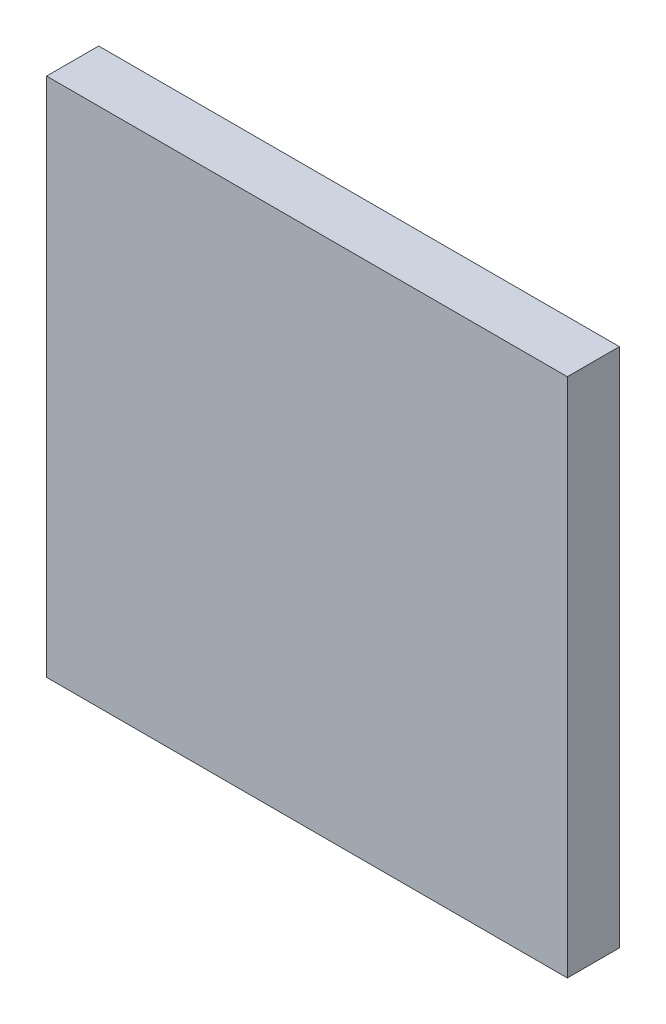
ISO-10303-21;
HEADER;
FILE_DESCRIPTION(('STEP AP214'),'2;1');
FILE_NAME('part.step','',(''),(''),'','','');
FILE_SCHEMA(('AUTOMOTIVE_DESIGN { 1 0 10303 214 1 1 1 1 }'));
ENDSEC;
DATA;
#1=APPLICATION_CONTEXT('core data for automotive mechanical design processes');
#2=APPLICATION_PROTOCOL_DEFINITION('international standard','automotive_design',2000,#1);
#3=PRODUCT_CONTEXT('',#1,'mechanical');
#4=PRODUCT('Part','Part','',(#3));
#5=PRODUCT_RELATED_PRODUCT_CATEGORY('part','',(#4));
#6=PRODUCT_DEFINITION_FORMATION('','',#4);
#7=PRODUCT_DEFINITION_CONTEXT('part definition',#1,'design');
#8=PRODUCT_DEFINITION('design','',#6,#7);
#9=PRODUCT_DEFINITION_SHAPE('','',#8);
#10=(LENGTH_UNIT() NAMED_UNIT(*) SI_UNIT(.MILLI.,.METRE.));
#11=(NAMED_UNIT(*) PLANE_ANGLE_UNIT() SI_UNIT($,.RADIAN.));
#12=(NAMED_UNIT(*) SI_UNIT($,.STERADIAN.) SOLID_ANGLE_UNIT());
#13=UNCERTAINTY_MEASURE_WITH_UNIT(LENGTH_MEASURE(1.E-05),#10,'distance_accuracy_value','');
#14=(GEOMETRIC_REPRESENTATION_CONTEXT(3) GLOBAL_UNCERTAINTY_ASSIGNED_CONTEXT((#13)) GLOBAL_UNIT_ASSIGNED_CONTEXT((#10,
#11,#12)) REPRESENTATION_CONTEXT('',''));
#15=CARTESIAN_POINT('',(0.,0.,0.));
#16=DIRECTION('',(0.,0.,1.));
#17=DIRECTION('',(1.,0.,0.));
#18=AXIS2_PLACEMENT_3D('',#15,#16,#17);
#19=CARTESIAN_POINT('',(99.9999999999999,100.,10.));
#20=DIRECTION('',(-1.,0.,0.));
#21=DIRECTION('',(0.,-1.,0.));
#22=AXIS2_PLACEMENT_3D('',#19,#20,#21);
#23=PLANE('',#22);
#24=DIRECTION('',(0.,1.,0.));
#25=VECTOR('',#24,1.);
#26=CARTESIAN_POINT('',(99.9999999999999,100.,-10.));
#27=LINE('',#26,#25);
#28=CARTESIAN_POINT('',(99.9999999999999,-100.,-10.));
#29=VERTEX_POINT('',#28);
#30=CARTESIAN_POINT('',(99.9999999999999,100.,-10.));
#31=VERTEX_POINT('',#30);
#32=EDGE_CURVE('E98',#29,#31,#27,.T.);
#33=ORIENTED_EDGE('',*,*,#32,.T.);
#34=DIRECTION('',(0.,0.,-1.));
#35=VECTOR('',#34,1.);
#36=CARTESIAN_POINT('',(99.9999999999999,100.,10.));
#37=LINE('',#36,#35);
#38=CARTESIAN_POINT('',(99.9999999999999,100.,10.));
#39=VERTEX_POINT('',#38);
#40=EDGE_CURVE('E11',#39,#31,#37,.T.);
#41=ORIENTED_EDGE('',*,*,#40,.F.);
#42=DIRECTION('',(0.,1.,0.));
#43=VECTOR('',#42,1.);
#44=CARTESIAN_POINT('',(99.9999999999999,100.,10.));
#45=LINE('',#44,#43);
#46=CARTESIAN_POINT('',(99.9999999999999,-100.,10.));
#47=VERTEX_POINT('',#46);
#48=EDGE_CURVE('E86',#47,#39,#45,.T.);
#49=ORIENTED_EDGE('',*,*,#48,.F.);
#50=DIRECTION('',(0.,0.,-1.));
#51=VECTOR('',#50,1.);
#52=CARTESIAN_POINT('',(99.9999999999999,-100.,10.));
#53=LINE('',#52,#51);
#54=EDGE_CURVE('E94',#47,#29,#53,.T.);
#55=ORIENTED_EDGE('',*,*,#54,.T.);
#56=EDGE_LOOP('',(#33,#41,#49,#55));
#57=FACE_BOUND('',#56,.T.);
#58=ADVANCED_FACE('F35',(#57),#23,.F.);
#59=CARTESIAN_POINT('',(-100.,100.,10.));
#60=DIRECTION('',(0.,-1.,0.));
#61=DIRECTION('',(0.,0.,-1.));
#62=AXIS2_PLACEMENT_3D('',#59,#60,#61);
#63=PLANE('',#62);
#64=DIRECTION('',(-1.,0.,0.));
#65=VECTOR('',#64,1.);
#66=CARTESIAN_POINT('',(-100.,100.,-10.));
#67=LINE('',#66,#65);
#68=CARTESIAN_POINT('',(-100.,100.,-10.));
#69=VERTEX_POINT('',#68);
#70=EDGE_CURVE('E90',#31,#69,#67,.T.);
#71=ORIENTED_EDGE('',*,*,#70,.T.);
#72=DIRECTION('',(0.,0.,-1.));
#73=VECTOR('',#72,1.);
#74=CARTESIAN_POINT('',(-100.,100.,10.));
#75=LINE('',#74,#73);
#76=CARTESIAN_POINT('',(-100.,100.,10.));
#77=VERTEX_POINT('',#76);
#78=EDGE_CURVE('E43',#77,#69,#75,.T.);
#79=ORIENTED_EDGE('',*,*,#78,.F.);
#80=DIRECTION('',(-1.,0.,0.));
#81=VECTOR('',#80,1.);
#82=CARTESIAN_POINT('',(-100.,100.,10.));
#83=LINE('',#82,#81);
#84=EDGE_CURVE('E81',#39,#77,#83,.T.);
#85=ORIENTED_EDGE('',*,*,#84,.F.);
#86=ORIENTED_EDGE('',*,*,#40,.T.);
#87=EDGE_LOOP('',(#71,#79,#85,#86));
#88=FACE_BOUND('',#87,.T.);
#89=ADVANCED_FACE('F89',(#88),#63,.F.);
#90=CARTESIAN_POINT('',(-100.,100.,10.));
#91=DIRECTION('',(1.,0.,0.));
#92=DIRECTION('',(0.,1.,0.));
#93=AXIS2_PLACEMENT_3D('',#90,#91,#92);
#94=PLANE('',#93);
#95=DIRECTION('',(0.,-1.,0.));
#96=VECTOR('',#95,1.);
#97=CARTESIAN_POINT('',(-100.,100.,-10.));
#98=LINE('',#97,#96);
#99=CARTESIAN_POINT('',(-100.,-100.,-10.));
#100=VERTEX_POINT('',#99);
#101=EDGE_CURVE('E68',#69,#100,#98,.T.);
#102=ORIENTED_EDGE('',*,*,#101,.T.);
#103=DIRECTION('',(0.,0.,-1.));
#104=VECTOR('',#103,1.);
#105=CARTESIAN_POINT('',(-100.,-100.,10.));
#106=LINE('',#105,#104);
#107=CARTESIAN_POINT('',(-100.,-100.,10.));
#108=VERTEX_POINT('',#107);
#109=EDGE_CURVE('E91',#108,#100,#106,.T.);
#110=ORIENTED_EDGE('',*,*,#109,.F.);
#111=DIRECTION('',(0.,-1.,0.));
#112=VECTOR('',#111,1.);
#113=CARTESIAN_POINT('',(-100.,100.,10.));
#114=LINE('',#113,#112);
#115=EDGE_CURVE('E84',#77,#108,#114,.T.);
#116=ORIENTED_EDGE('',*,*,#115,.F.);
#117=ORIENTED_EDGE('',*,*,#78,.T.);
#118=EDGE_LOOP('',(#102,#110,#116,#117));
#119=FACE_BOUND('',#118,.T.);
#120=ADVANCED_FACE('F92',(#119),#94,.F.);
#121=CARTESIAN_POINT('',(-100.,-100.,10.));
#122=DIRECTION('',(0.,1.,0.));
#123=DIRECTION('',(0.,0.,1.));
#124=AXIS2_PLACEMENT_3D('',#121,#122,#123);
#125=PLANE('',#124);
#126=DIRECTION('',(1.,0.,0.));
#127=VECTOR('',#126,1.);
#128=CARTESIAN_POINT('',(-100.,-100.,-10.));
#129=LINE('',#128,#127);
#130=EDGE_CURVE('E74',#100,#29,#129,.T.);
#131=ORIENTED_EDGE('',*,*,#130,.T.);
#132=ORIENTED_EDGE('',*,*,#54,.F.);
#133=DIRECTION('',(1.,0.,0.));
#134=VECTOR('',#133,1.);
#135=CARTESIAN_POINT('',(-100.,-100.,10.));
#136=LINE('',#135,#134);
#137=EDGE_CURVE('E51',#108,#47,#136,.T.);
#138=ORIENTED_EDGE('',*,*,#137,.F.);
#139=ORIENTED_EDGE('',*,*,#109,.T.);
#140=EDGE_LOOP('',(#131,#132,#138,#139));
#141=FACE_BOUND('',#140,.T.);
#142=ADVANCED_FACE('F105',(#141),#125,.F.);
#143=CARTESIAN_POINT('',(0.,0.,10.));
#144=DIRECTION('',(0.,0.,1.));
#145=DIRECTION('',(1.,0.,0.));
#146=AXIS2_PLACEMENT_3D('',#143,#144,#145);
#147=PLANE('',#146);
#148=ORIENTED_EDGE('',*,*,#48,.T.);
#149=ORIENTED_EDGE('',*,*,#84,.T.);
#150=ORIENTED_EDGE('',*,*,#115,.T.);
#151=ORIENTED_EDGE('',*,*,#137,.T.);
#152=EDGE_LOOP('',(#148,#149,#150,#151));
#153=FACE_BOUND('',#152,.T.);
#154=ADVANCED_FACE('F82',(#153),#147,.T.);
#155=CARTESIAN_POINT('',(0.,0.,-10.));
#156=DIRECTION('',(0.,0.,1.));
#157=DIRECTION('',(1.,0.,0.));
#158=AXIS2_PLACEMENT_3D('',#155,#156,#157);
#159=PLANE('',#158);
#160=ORIENTED_EDGE('',*,*,#32,.F.);
#161=ORIENTED_EDGE('',*,*,#130,.F.);
#162=ORIENTED_EDGE('',*,*,#101,.F.);
#163=ORIENTED_EDGE('',*,*,#70,.F.);
#164=EDGE_LOOP('',(#160,#161,#162,#163));
#165=FACE_BOUND('',#164,.T.);
#166=ADVANCED_FACE('F108',(#165),#159,.F.);
#167=CLOSED_SHELL('',(#58,#89,#120,#142,#154,#166));
#168=MANIFOLD_SOLID_BREP('B2',#167);
#169=ADVANCED_BREP_SHAPE_REPRESENTATION('',(#18,#168),#14);
#170=SHAPE_DEFINITION_REPRESENTATION(#9,#169);
ENDSEC;
END-ISO-10303-21;
